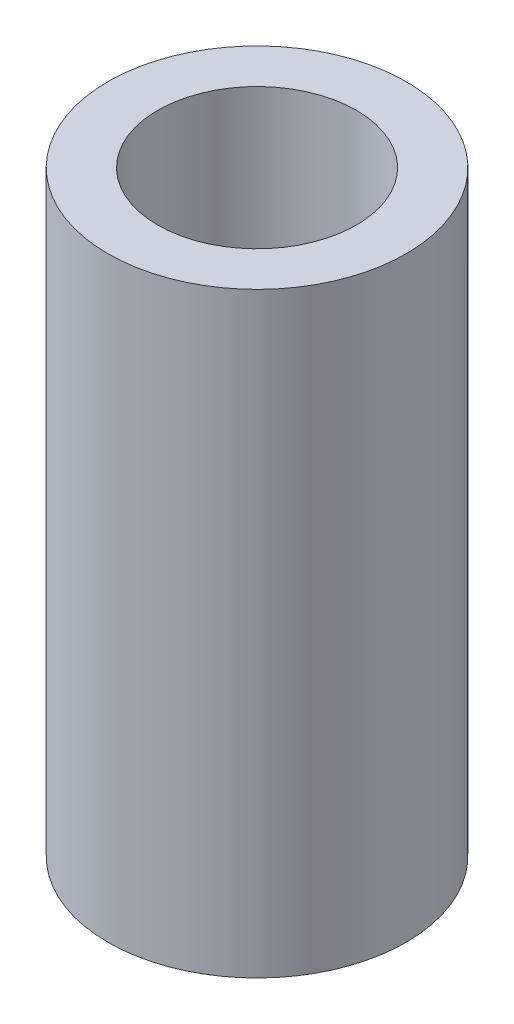
ISO-10303-21;
HEADER;
FILE_DESCRIPTION(('STEP AP214'),'2;1');
FILE_NAME('part.step','',(''),(''),'','','');
FILE_SCHEMA(('AUTOMOTIVE_DESIGN { 1 0 10303 214 1 1 1 1 }'));
ENDSEC;
DATA;
#1=APPLICATION_CONTEXT('core data for automotive mechanical design processes');
#2=APPLICATION_PROTOCOL_DEFINITION('international standard','automotive_design',2000,#1);
#3=PRODUCT_CONTEXT('',#1,'mechanical');
#4=PRODUCT('Part','Part','',(#3));
#5=PRODUCT_RELATED_PRODUCT_CATEGORY('part','',(#4));
#6=PRODUCT_DEFINITION_FORMATION('','',#4);
#7=PRODUCT_DEFINITION_CONTEXT('part definition',#1,'design');
#8=PRODUCT_DEFINITION('design','',#6,#7);
#9=PRODUCT_DEFINITION_SHAPE('','',#8);
#10=(LENGTH_UNIT() NAMED_UNIT(*) SI_UNIT(.MILLI.,.METRE.));
#11=(NAMED_UNIT(*) PLANE_ANGLE_UNIT() SI_UNIT($,.RADIAN.));
#12=(NAMED_UNIT(*) SI_UNIT($,.STERADIAN.) SOLID_ANGLE_UNIT());
#13=UNCERTAINTY_MEASURE_WITH_UNIT(LENGTH_MEASURE(1.E-05),#10,'distance_accuracy_value','');
#14=(GEOMETRIC_REPRESENTATION_CONTEXT(3) GLOBAL_UNCERTAINTY_ASSIGNED_CONTEXT((#13)) GLOBAL_UNIT_ASSIGNED_CONTEXT((#10,
#11,#12)) REPRESENTATION_CONTEXT('',''));
#15=CARTESIAN_POINT('',(0.,0.,0.));
#16=DIRECTION('',(0.,0.,1.));
#17=DIRECTION('',(1.,0.,0.));
#18=AXIS2_PLACEMENT_3D('',#15,#16,#17);
#19=CARTESIAN_POINT('',(0.,9.,0.));
#20=DIRECTION('',(0.,1.,0.));
#21=DIRECTION('',(0.,0.,1.));
#22=AXIS2_PLACEMENT_3D('',#19,#20,#21);
#23=PLANE('',#22);
#24=CARTESIAN_POINT('',(0.,9.,0.));
#25=DIRECTION('',(0.,1.,0.));
#26=DIRECTION('',(0.,0.,1.));
#27=AXIS2_PLACEMENT_3D('',#24,#25,#26);
#28=CIRCLE('',#27,2.25);
#29=CARTESIAN_POINT('',(0.,9.,2.25));
#30=VERTEX_POINT('',#29);
#31=EDGE_CURVE('E10',#30,#30,#28,.T.);
#32=ORIENTED_EDGE('',*,*,#31,.T.);
#33=EDGE_LOOP('',(#32));
#34=FACE_BOUND('',#33,.T.);
#35=CARTESIAN_POINT('',(0.,9.,0.));
#36=DIRECTION('',(0.,1.,0.));
#37=DIRECTION('',(0.,0.,1.));
#38=AXIS2_PLACEMENT_3D('',#35,#36,#37);
#39=CIRCLE('',#38,1.5);
#40=CARTESIAN_POINT('',(0.,9.,1.5));
#41=VERTEX_POINT('',#40);
#42=EDGE_CURVE('E43',#41,#41,#39,.T.);
#43=ORIENTED_EDGE('',*,*,#42,.F.);
#44=EDGE_LOOP('',(#43));
#45=FACE_BOUND('',#44,.T.);
#46=ADVANCED_FACE('F32',(#34,#45),#23,.T.);
#47=CARTESIAN_POINT('',(0.,0.,0.));
#48=DIRECTION('',(0.,1.,0.));
#49=DIRECTION('',(0.,0.,1.));
#50=AXIS2_PLACEMENT_3D('',#47,#48,#49);
#51=PLANE('',#50);
#52=CARTESIAN_POINT('',(0.,0.,0.));
#53=DIRECTION('',(0.,1.,0.));
#54=DIRECTION('',(0.,0.,1.));
#55=AXIS2_PLACEMENT_3D('',#52,#53,#54);
#56=CIRCLE('',#55,2.25);
#57=CARTESIAN_POINT('',(0.,0.,2.25));
#58=VERTEX_POINT('',#57);
#59=EDGE_CURVE('E36',#58,#58,#56,.T.);
#60=ORIENTED_EDGE('',*,*,#59,.F.);
#61=EDGE_LOOP('',(#60));
#62=FACE_BOUND('',#61,.T.);
#63=CARTESIAN_POINT('',(0.,0.,0.));
#64=DIRECTION('',(0.,1.,0.));
#65=DIRECTION('',(0.,0.,1.));
#66=AXIS2_PLACEMENT_3D('',#63,#64,#65);
#67=CIRCLE('',#66,1.5);
#68=CARTESIAN_POINT('',(0.,0.,1.5));
#69=VERTEX_POINT('',#68);
#70=EDGE_CURVE('E45',#69,#69,#67,.T.);
#71=ORIENTED_EDGE('',*,*,#70,.T.);
#72=EDGE_LOOP('',(#71));
#73=FACE_BOUND('',#72,.T.);
#74=ADVANCED_FACE('F55',(#62,#73),#51,.F.);
#75=CARTESIAN_POINT('',(0.,9.,0.));
#76=DIRECTION('',(0.,-1.,0.));
#77=DIRECTION('',(0.,0.,-1.));
#78=AXIS2_PLACEMENT_3D('',#75,#76,#77);
#79=CYLINDRICAL_SURFACE('',#78,2.25);
#80=ORIENTED_EDGE('',*,*,#31,.F.);
#81=EDGE_LOOP('',(#80));
#82=FACE_BOUND('',#81,.T.);
#83=ORIENTED_EDGE('',*,*,#59,.T.);
#84=EDGE_LOOP('',(#83));
#85=FACE_BOUND('',#84,.T.);
#86=ADVANCED_FACE('F34',(#82,#85),#79,.T.);
#87=CARTESIAN_POINT('',(0.,9.,0.));
#88=DIRECTION('',(0.,-1.,0.));
#89=DIRECTION('',(0.,0.,-1.));
#90=AXIS2_PLACEMENT_3D('',#87,#88,#89);
#91=CYLINDRICAL_SURFACE('',#90,1.5);
#92=ORIENTED_EDGE('',*,*,#42,.T.);
#93=EDGE_LOOP('',(#92));
#94=FACE_BOUND('',#93,.T.);
#95=ORIENTED_EDGE('',*,*,#70,.F.);
#96=EDGE_LOOP('',(#95));
#97=FACE_BOUND('',#96,.T.);
#98=ADVANCED_FACE('F51',(#94,#97),#91,.F.);
#99=CLOSED_SHELL('',(#46,#74,#86,#98));
#100=MANIFOLD_SOLID_BREP('B2',#99);
#101=ADVANCED_BREP_SHAPE_REPRESENTATION('',(#18,#100),#14);
#102=SHAPE_DEFINITION_REPRESENTATION(#9,#101);
ENDSEC;
END-ISO-10303-21;
